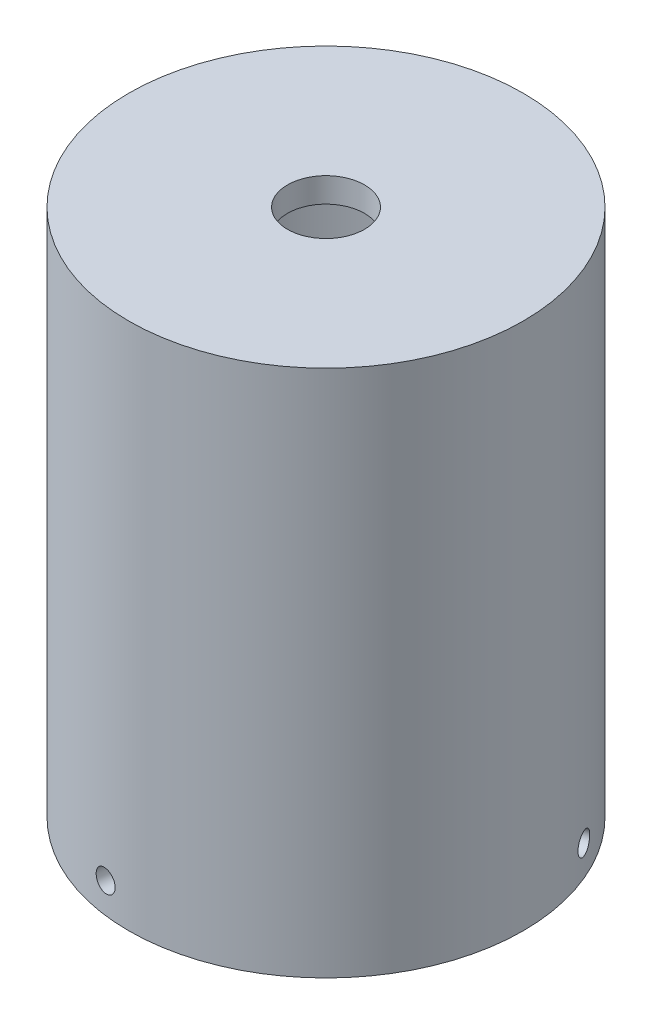
ISO-10303-21;
HEADER;
FILE_DESCRIPTION(('STEP AP214'),'2;1');
FILE_NAME('part.step','',(''),(''),'','','');
FILE_SCHEMA(('AUTOMOTIVE_DESIGN { 1 0 10303 214 1 1 1 1 }'));
ENDSEC;
DATA;
#1=APPLICATION_CONTEXT('core data for automotive mechanical design processes');
#2=APPLICATION_PROTOCOL_DEFINITION('international standard','automotive_design',2000,#1);
#3=PRODUCT_CONTEXT('',#1,'mechanical');
#4=PRODUCT('Part','Part','',(#3));
#5=PRODUCT_RELATED_PRODUCT_CATEGORY('part','',(#4));
#6=PRODUCT_DEFINITION_FORMATION('','',#4);
#7=PRODUCT_DEFINITION_CONTEXT('part definition',#1,'design');
#8=PRODUCT_DEFINITION('design','',#6,#7);
#9=PRODUCT_DEFINITION_SHAPE('','',#8);
#10=(LENGTH_UNIT() NAMED_UNIT(*) SI_UNIT(.MILLI.,.METRE.));
#11=(NAMED_UNIT(*) PLANE_ANGLE_UNIT() SI_UNIT($,.RADIAN.));
#12=(NAMED_UNIT(*) SI_UNIT($,.STERADIAN.) SOLID_ANGLE_UNIT());
#13=UNCERTAINTY_MEASURE_WITH_UNIT(LENGTH_MEASURE(1.E-05),#10,'distance_accuracy_value','');
#14=(GEOMETRIC_REPRESENTATION_CONTEXT(3) GLOBAL_UNCERTAINTY_ASSIGNED_CONTEXT((#13)) GLOBAL_UNIT_ASSIGNED_CONTEXT((#10,
#11,#12)) REPRESENTATION_CONTEXT('',''));
#15=CARTESIAN_POINT('',(0.,0.,0.));
#16=DIRECTION('',(0.,0.,1.));
#17=DIRECTION('',(1.,0.,0.));
#18=AXIS2_PLACEMENT_3D('',#15,#16,#17);
#19=CARTESIAN_POINT('',(0.,58.70448,0.));
#20=DIRECTION('',(0.,-1.,0.));
#21=DIRECTION('',(0.,0.,-1.));
#22=AXIS2_PLACEMENT_3D('',#19,#20,#21);
#23=CYLINDRICAL_SURFACE('',#22,20.32);
#24=CARTESIAN_POINT('',(0.,58.70448,0.));
#25=DIRECTION('',(0.,1.,0.));
#26=DIRECTION('',(0.,0.,1.));
#27=AXIS2_PLACEMENT_3D('',#24,#25,#26);
#28=CIRCLE('',#27,20.32);
#29=CARTESIAN_POINT('',(0.,58.70448,20.32));
#30=VERTEX_POINT('',#29);
#31=EDGE_CURVE('E135',#30,#30,#28,.T.);
#32=ORIENTED_EDGE('',*,*,#31,.F.);
#33=EDGE_LOOP('',(#32));
#34=FACE_BOUND('',#33,.T.);
#35=CARTESIAN_POINT('',(-1.44359005239669,7.42497444509593,20.268656782348));
#36=CARTESIAN_POINT('',(-1.44359287954379,7.36153771357379,20.268656847362));
#37=CARTESIAN_POINT('',(-1.44894348586358,7.29805623479731,20.2682776971704));
#38=CARTESIAN_POINT('',(-1.47020871378882,7.17284520761524,20.266746053452));
#39=CARTESIAN_POINT('',(-1.48613571866115,7.11111780139687,20.2655926533855));
#40=CARTESIAN_POINT('',(-1.52808637144115,6.99124680184932,20.2624725014437));
#41=CARTESIAN_POINT('',(-1.55410479522144,6.93310137222071,20.2605061703721));
#42=CARTESIAN_POINT('',(-1.61547725837342,6.82202542850606,20.2557047779409));
#43=CARTESIAN_POINT('',(-1.65082912199278,6.76909370297786,20.2528699190223));
#44=CARTESIAN_POINT('',(-1.72989494339083,6.66986762198261,20.2462696370903));
#45=CARTESIAN_POINT('',(-1.77361782159926,6.62358044007134,20.2425032201168));
#46=CARTESIAN_POINT('',(-1.86814720237509,6.53901864236272,20.2339979566597));
#47=CARTESIAN_POINT('',(-1.91895399659822,6.50074435663103,20.2292590701342));
#48=CARTESIAN_POINT('',(-2.02622937700267,6.43327401163424,20.2187956191118));
#49=CARTESIAN_POINT('',(-2.08270151656757,6.40408369763587,20.21307043436));
#50=CARTESIAN_POINT('',(-2.19966368768284,6.35564673260612,20.2006765864036));
#51=CARTESIAN_POINT('',(-2.26015368350121,6.33639999315687,20.194007931589));
#52=CARTESIAN_POINT('',(-2.38335648449181,6.30841590392441,20.1798377278012));
#53=CARTESIAN_POINT('',(-2.44606690059685,6.2996675920678,20.1723370565478));
#54=CARTESIAN_POINT('',(-2.57198133917894,6.29289485040135,20.1566697730695));
#55=CARTESIAN_POINT('',(-2.63518535705617,6.29487032077638,20.1485031670438));
#56=CARTESIAN_POINT('',(-2.76022047186734,6.30947999492297,20.1317549744249));
#57=CARTESIAN_POINT('',(-2.8220530104769,6.32210240306245,20.1231738569792));
#58=CARTESIAN_POINT('',(-2.94267201537549,6.35762935537082,20.1058895844784));
#59=CARTESIAN_POINT('',(-3.00145846666781,6.38053395015635,20.0971864288229));
#60=CARTESIAN_POINT('',(-3.11436685139023,6.4359885088971,20.079999643428));
#61=CARTESIAN_POINT('',(-3.16848616999787,6.4685438350595,20.0715161385895));
#62=CARTESIAN_POINT('',(-3.27051250942365,6.54237182140925,20.05514452497));
#63=CARTESIAN_POINT('',(-3.31841947535938,6.58364455860124,20.0472564214493));
#64=CARTESIAN_POINT('',(-3.4067479376852,6.67380244177053,20.0324357340963));
#65=CARTESIAN_POINT('',(-3.44715920684189,6.72269782330097,20.0255044590224));
#66=CARTESIAN_POINT('',(-3.51928947435293,6.82667711873191,20.0129544620733));
#67=CARTESIAN_POINT('',(-3.55100846995532,6.88176103459168,20.0073357406137));
#68=CARTESIAN_POINT('',(-3.60486968742671,6.99656013215168,19.9977015396717));
#69=CARTESIAN_POINT('',(-3.627011507189,7.056275508184,19.9936861275065));
#70=CARTESIAN_POINT('',(-3.66109562599073,7.17863953403089,19.9874731155825));
#71=CARTESIAN_POINT('',(-3.67303801999072,7.24128815653009,19.9852754988994));
#72=CARTESIAN_POINT('',(-3.68637886020456,7.36765044338576,19.9828190664023));
#73=CARTESIAN_POINT('',(-3.68779141156779,7.43136256836368,19.9825576569635));
#74=CARTESIAN_POINT('',(-3.6800701584885,7.55812230409682,19.9839810459443));
#75=CARTESIAN_POINT('',(-3.67093639736236,7.62116991758028,19.9856658363705));
#76=CARTESIAN_POINT('',(-3.64238798468351,7.74477060236504,19.9908883733897));
#77=CARTESIAN_POINT('',(-3.62297980911432,7.8053252191243,19.9944249527811));
#78=CARTESIAN_POINT('',(-3.57442881563469,7.92226863545931,20.003161338063));
#79=CARTESIAN_POINT('',(-3.54528592785232,7.9786574051307,20.0083611558915));
#80=CARTESIAN_POINT('',(-3.47804091056071,8.08573429461587,20.0201596775436));
#81=CARTESIAN_POINT('',(-3.43992928330127,8.13641628633745,20.0267598636004));
#82=CARTESIAN_POINT('',(-3.3558239875681,8.23057926371157,20.0410244210914));
#83=CARTESIAN_POINT('',(-3.30983025740412,8.27406019299887,20.0486888008546));
#84=CARTESIAN_POINT('',(-3.2111865131464,8.35263500806726,20.0647246698379));
#85=CARTESIAN_POINT('',(-3.15852924947262,8.38771963707267,20.0730969258481));
#86=CARTESIAN_POINT('',(-3.04807179835381,8.44844262109852,20.0901661815556));
#87=CARTESIAN_POINT('',(-2.99027163725712,8.47408102451086,20.0988631795891));
#88=CARTESIAN_POINT('',(-2.87118894999741,8.51516762603672,20.1162195604569));
#89=CARTESIAN_POINT('',(-2.80990846073175,8.53062171920799,20.1248789621645));
#90=CARTESIAN_POINT('',(-2.68556785406956,8.55092031488673,20.1418484945541));
#91=CARTESIAN_POINT('',(-2.62250774987123,8.55576489605688,20.1501586278254));
#92=CARTESIAN_POINT('',(-2.49648609130632,8.55470620160025,20.166159433982));
#93=CARTESIAN_POINT('',(-2.43352451885574,8.54881743142448,20.1738509282535));
#94=CARTESIAN_POINT('',(-2.30940573550969,8.52648921909342,20.1884360808148));
#95=CARTESIAN_POINT('',(-2.24824852792591,8.51004975757496,20.1953297376404));
#96=CARTESIAN_POINT('',(-2.12948137861428,8.46708993143515,20.2081983368409));
#97=CARTESIAN_POINT('',(-2.07187144379776,8.44056954717338,20.2141732774258));
#98=CARTESIAN_POINT('',(-1.96184305937155,8.37820294763725,20.2251485184302));
#99=CARTESIAN_POINT('',(-1.90942446092262,8.34235699984022,20.2301488467964));
#100=CARTESIAN_POINT('',(-1.81121165494345,8.26230398349598,20.2391786359853));
#101=CARTESIAN_POINT('',(-1.76542573837346,8.21808660703176,20.243206885809));
#102=CARTESIAN_POINT('',(-1.68185892945029,8.12255641047416,20.2503213430568));
#103=CARTESIAN_POINT('',(-1.64408000491755,8.0712418512664,20.2534073189869));
#104=CARTESIAN_POINT('',(-1.57759580572137,7.96292586948607,20.2586946380887));
#105=CARTESIAN_POINT('',(-1.54890035479226,7.90591837705834,20.2608950241922));
#106=CARTESIAN_POINT('',(-1.50149842297478,7.7879207329299,20.2644633001595));
#107=CARTESIAN_POINT('',(-1.48278018527451,7.72693536420417,20.2658321701208));
#108=CARTESIAN_POINT('',(-1.46076605617782,7.62547366911425,20.2674278262941));
#109=CARTESIAN_POINT('',(-1.45433346488306,7.58565398005583,20.2678892094909));
#110=CARTESIAN_POINT('',(-1.44574456731452,7.50555369464658,20.2685036667013));
#111=CARTESIAN_POINT('',(-1.44358825643055,7.4652730987927,20.2686567410474));
#112=CARTESIAN_POINT('',(-1.44359005239669,7.42497444509593,20.268656782348));
#113=B_SPLINE_CURVE_WITH_KNOTS('',3,(#35,#36,#37,#38,#39,#40,#41,#42,#43,#44,#45,#46,#47,#48,
#49,#50,#51,#52,#53,#54,#55,#56,#57,#58,#59,#60,#61,#62,#63,#64,#65,#66,#67,#68,#69,#70,#71,#72,
#73,#74,#75,#76,#77,#78,#79,#80,#81,#82,#83,#84,#85,#86,#87,#88,#89,#90,#91,#92,#93,#94,#95,#96,
#97,#98,#99,#100,#101,#102,#103,#104,#105,#106,#107,#108,#109,#110,#111,#112),.UNSPECIFIED.,.T.,
.F.,(4,2,2,2,2,2,2,2,2,2,2,2,2,2,2,2,2,2,2,2,2,2,2,2,2,2,2,2,2,2,2,2,2,2,2,2,2,2,4),(0.,
0.190163084943531,0.380549213866286,0.570836914933274,0.761080296444164,0.951527547471873,
1.1419826418229,1.33255794811556,1.52313155979104,1.71350600785987,1.90387868395929,
2.09404072474507,2.28420370166144,2.47447253694292,2.66474305302133,2.85527129729503,
3.04579960188972,3.23633590521789,3.42687043456114,3.61714968926747,3.8074281624513,
3.99758684528703,4.18774689303622,4.37810923067155,4.5684730582691,4.75904580169289,
4.94961756882145,5.14007892880164,5.33053887662909,5.5207416206067,5.71094471365482,
5.90114817727284,6.09134618604551,6.28177993099796,6.47226042334224,6.66294622114769,
6.85340682168653,6.97420946053435,7.09501196914681),.UNSPECIFIED.);
#114=CARTESIAN_POINT('',(-1.44359005239669,7.42497444509593,20.268656782348));
#115=VERTEX_POINT('',#114);
#116=EDGE_CURVE('E66',#115,#115,#113,.T.);
#117=ORIENTED_EDGE('',*,*,#116,.T.);
#118=EDGE_LOOP('',(#117));
#119=FACE_BOUND('',#118,.T.);
#120=CARTESIAN_POINT('',(-16.8313766479027,7.42497444509593,-11.3845140492001));
#121=CARTESIAN_POINT('',(-16.831375290633,7.36153771357379,-11.3845165300883));
#122=CARTESIAN_POINT('',(-16.8283716337753,7.29805623479731,-11.3889607159911));
#123=CARTESIAN_POINT('',(-16.816412577443,7.17284520761524,-11.4066111217324));
#124=CARTESIAN_POINT('',(-16.8074502012485,7.11111780139687,-11.4198276125248));
#125=CARTESIAN_POINT('',(-16.7837727440132,6.99124680184932,-11.4545978675668));
#126=CARTESIAN_POINT('',(-16.7690606394628,6.93310137222071,-11.4761473179911));
#127=CARTESIAN_POINT('',(-16.7342162800679,6.82202542850606,-11.5268967339579));
#128=CARTESIAN_POINT('',(-16.7140852884186,6.76909370297786,-11.5560949164642));
#129=CARTESIAN_POINT('',(-16.6688363658943,6.66986762198261,-11.6212677853999));
#130=CARTESIAN_POINT('',(-16.6437131140098,6.62358044007134,-11.6572497001683));
#131=CARTESIAN_POINT('',(-16.5890826494021,6.53901864236272,-11.7348619135956));
#132=CARTESIAN_POINT('',(-16.5595752561738,6.50074435663103,-11.7764924448149));
#133=CARTESIAN_POINT('',(-16.4968759515749,6.43327401163424,-11.8641639239346));
#134=CARTESIAN_POINT('',(-16.4636817263561,6.40408369763587,-11.910207639028));
#135=CARTESIAN_POINT('',(-16.3944672536176,6.35564673260612,-12.0053029265174));
#136=CARTESIAN_POINT('',(-16.3584470312299,6.33639999315687,-12.0543544721636));
#137=CARTESIAN_POINT('',(-16.2845738742775,6.30841590392441,-12.1539661257449));
#138=CARTESIAN_POINT('',(-16.2467228943741,6.2996675920678,-12.2045246035471));
#139=CARTESIAN_POINT('',(-16.1701974095826,6.29289485040135,-12.3057360643233));
#140=CARTESIAN_POINT('',(-16.131522912363,6.29487032077638,-12.3563890464134));
#141=CARTESIAN_POINT('',(-16.054500994682,6.30947999492297,-12.4562985358955));
#142=CARTESIAN_POINT('',(-16.0161532596763,6.32210240306245,-12.505556526389));
#143=CARTESIAN_POINT('',(-15.9408751381554,6.35762935537082,-12.60137351256));
#144=CARTESIAN_POINT('',(-15.9039447586185,6.38053395015635,-12.6479324949497));
#145=CARTESIAN_POINT('',(-15.8326063734959,6.43598850889709,-12.7371206317222));
#146=CARTESIAN_POINT('',(-15.7981997834889,6.4685438350595,-12.7797475840526));
#147=CARTESIAN_POINT('',(-15.7330083804805,6.54237182140925,-12.8599191790408));
#148=CARTESIAN_POINT('',(-15.702223599476,6.58364455860124,-12.897463776799));
#149=CARTESIAN_POINT('',(-15.6452242765639,6.67380244177053,-12.9665481253739));
#150=CARTESIAN_POINT('',(-15.619015981691,6.72269782330097,-12.9980796735258));
#151=CARTESIAN_POINT('',(-15.5720822317601,6.82667711873191,-13.0542713190976));
#152=CARTESIAN_POINT('',(-15.5513567784381,6.88176103459168,-13.0789314143419));
#153=CARTESIAN_POINT('',(-15.5160827069415,6.99656013215168,-13.1207594964799));
#154=CARTESIAN_POINT('',(-15.5015343481186,7.056275508184,-13.1379271687975));
#155=CARTESIAN_POINT('',(-15.4791116625575,7.17863953403089,-13.1643383755834));
#156=CARTESIAN_POINT('',(-15.4712372736822,7.24128815653009,-13.1735819838278));
#157=CARTESIAN_POINT('',(-15.4624395206301,7.36765044338576,-13.1839072741123));
#158=CARTESIAN_POINT('',(-15.4615068577336,7.43136256836368,-13.1849998747576));
#159=CARTESIAN_POINT('',(-15.4666001752902,7.55812230409682,-13.1790247679323));
#160=CARTESIAN_POINT('',(-15.4726261271624,7.62116991758028,-13.1719570939781));
#161=CARTESIAN_POINT('',(-15.4914231832326,7.74477060236504,-13.14984471187));
#162=CARTESIAN_POINT('',(-15.5041900386127,7.8053252191243,-13.1348050284817));
#163=CARTESIAN_POINT('',(-15.5360314669439,7.92226863545931,-13.0971268273903));
#164=CARTESIAN_POINT('',(-15.5551060851696,7.9786574051307,-13.0744882551454));
#165=CARTESIAN_POINT('',(-15.5989464132932,8.08573429461587,-13.022151622719));
#166=CARTESIAN_POINT('',(-15.6237181557178,8.13641628633745,-12.9924460783611));
#167=CARTESIAN_POINT('',(-15.6781242727453,8.23057926371157,-12.9267410344089));
#168=CARTESIAN_POINT('',(-15.7077586854065,8.27406019299888,-12.8907414855537));
#169=CARTESIAN_POINT('',(-15.7709680274467,8.35263500806727,-12.8133314315938));
#170=CARTESIAN_POINT('',(-15.8045472456754,8.38771963707267,-12.7719150315636));
#171=CARTESIAN_POINT('',(-15.8745583803012,8.44844262109852,-12.6847907007112));
#172=CARTESIAN_POINT('',(-15.9109902820832,8.47408102451086,-12.6390827918754));
#173=CARTESIAN_POINT('',(-15.9855626924624,8.51516762603672,-12.5446323499915));
#174=CARTESIAN_POINT('',(-16.0237021989555,8.530621719208,-12.4958915903848));
#175=CARTESIAN_POINT('',(-16.1005685484264,8.55092031488674,-12.3966942324882));
#176=CARTESIAN_POINT('',(-16.1392953870473,8.55576489605688,-12.3462376469228));
#177=CARTESIAN_POINT('',(-16.2161633209424,8.55470620160025,-12.2451000922568));
#178=CARTESIAN_POINT('',(-16.2543051365999,8.54881743142448,-12.1944195181882));
#179=CARTESIAN_POINT('',(-16.3289956409091,8.52648921909342,-12.0942220750044));
#180=CARTESIAN_POINT('',(-16.3655443266369,8.51004975757496,-12.0447052080251));
#181=CARTESIAN_POINT('',(-16.4360724351114,8.46708993143515,-11.9482841391864));
#182=CARTESIAN_POINT('',(-16.4700518528523,8.44056954717338,-11.9013799424174));
#183=CARTESIAN_POINT('',(-16.5345708825879,8.37820294763725,-11.8115801868691));
#184=CARTESIAN_POINT('',(-16.5651105932048,8.34235699984022,-11.7686845131647));
#185=CARTESIAN_POINT('',(-16.6220370230228,8.26230398349598,-11.6881446228042));
#186=CARTESIAN_POINT('',(-16.6484185479879,8.21808660703176,-11.6505069808309));
#187=CARTESIAN_POINT('',(-16.6963632531602,8.12255641047416,-11.5816932300141));
#188=CARTESIAN_POINT('',(-16.7179252489775,8.07124185126639,-11.5505187096062));
#189=CARTESIAN_POINT('',(-16.7557463012357,7.96292586948607,-11.4955853637029));
#190=CARTESIAN_POINT('',(-16.771999616964,7.90591837705833,-11.471834567277));
#191=CARTESIAN_POINT('',(-16.7987908005081,7.78792073292989,-11.4325674281182));
#192=CARTESIAN_POINT('',(-16.8093353955193,7.72693536420417,-11.4170413937364));
#193=CARTESIAN_POINT('',(-16.8217243388494,7.62547366911425,-11.3987744267831));
#194=CARTESIAN_POINT('',(-16.825340204066,7.58565398005583,-11.3934343309081));
#195=CARTESIAN_POINT('',(-16.8301667884041,7.50555369464658,-11.3863033560284));
#196=CARTESIAN_POINT('',(-16.8313775101184,7.4652730987927,-11.3845124731975));
#197=CARTESIAN_POINT('',(-16.8313766479027,7.42497444509593,-11.3845140492001));
#198=B_SPLINE_CURVE_WITH_KNOTS('',3,(#120,#121,#122,#123,#124,#125,#126,#127,#128,#129,#130,
#131,#132,#133,#134,#135,#136,#137,#138,#139,#140,#141,#142,#143,#144,#145,#146,#147,#148,#149,
#150,#151,#152,#153,#154,#155,#156,#157,#158,#159,#160,#161,#162,#163,#164,#165,#166,#167,#168,
#169,#170,#171,#172,#173,#174,#175,#176,#177,#178,#179,#180,#181,#182,#183,#184,#185,#186,#187,
#188,#189,#190,#191,#192,#193,#194,#195,#196,#197),.UNSPECIFIED.,.T.,.F.,(4,2,2,2,2,2,2,2,2,2,2,
2,2,2,2,2,2,2,2,2,2,2,2,2,2,2,2,2,2,2,2,2,2,2,2,2,2,2,4),(0.,0.19016308494353,0.380549213866286,
0.570836914933275,0.761080296444163,0.951527547471873,1.1419826418229,1.33255794811556,
1.52313155979104,1.71350600785988,1.90387868395929,2.09404072474506,2.28420370166144,
2.47447253694292,2.66474305302133,2.85527129729503,3.04579960188972,3.23633590521789,
3.42687043456114,3.61714968926746,3.8074281624513,3.99758684528703,4.18774689303622,
4.37810923067155,4.5684730582691,4.75904580169289,4.94961756882145,5.14007892880164,
5.33053887662909,5.5207416206067,5.71094471365482,5.90114817727285,6.09134618604551,
6.28177993099795,6.47226042334224,6.66294622114769,6.85340682168653,6.97420946053435,
7.0950119691468),.UNSPECIFIED.);
#199=CARTESIAN_POINT('',(-16.8313766479027,7.42497444509593,-11.3845140492001));
#200=VERTEX_POINT('',#199);
#201=EDGE_CURVE('E60',#200,#200,#198,.T.);
#202=ORIENTED_EDGE('',*,*,#201,.T.);
#203=EDGE_LOOP('',(#202));
#204=FACE_BOUND('',#203,.T.);
#205=CARTESIAN_POINT('',(18.2749667002996,7.42497444509593,-8.88414273314778));
#206=CARTESIAN_POINT('',(18.2749681701769,7.36153771357379,-8.88414031727359));
#207=CARTESIAN_POINT('',(18.277315119639,7.29805623479731,-8.8793169811792));
#208=CARTESIAN_POINT('',(18.2866212912319,7.17284520761524,-8.86013493171946));
#209=CARTESIAN_POINT('',(18.2935859199098,7.11111780139687,-8.84576504086056));
#210=CARTESIAN_POINT('',(18.3118591154545,6.99124680184932,-8.80787463387686));
#211=CARTESIAN_POINT('',(18.3231654346844,6.93310137222071,-8.78435885238088));
#212=CARTESIAN_POINT('',(18.3496935384414,6.82202542850606,-8.72880804398284));
#213=CARTESIAN_POINT('',(18.3649144104115,6.76909370297786,-8.69677500255809));
#214=CARTESIAN_POINT('',(18.3987313092853,6.66986762198261,-8.62500185169029));
#215=CARTESIAN_POINT('',(18.4173309356092,6.62358044007134,-8.58525351994847));
#216=CARTESIAN_POINT('',(18.4572298517773,6.53901864236272,-8.49913604306401));
#217=CARTESIAN_POINT('',(18.4785292527722,6.50074435663103,-8.45276662531918));
#218=CARTESIAN_POINT('',(18.5231053285777,6.43327401163424,-8.35463169517708));
#219=CARTESIAN_POINT('',(18.5463832429238,6.40408369763587,-8.30286279533194));
#220=CARTESIAN_POINT('',(18.5941309413006,6.35564673260612,-8.19537365988614));
#221=CARTESIAN_POINT('',(18.6186007147312,6.33639999315687,-8.1396534594253));
#222=CARTESIAN_POINT('',(18.6679303587694,6.30841590392441,-8.02587160205614));
#223=CARTESIAN_POINT('',(18.6927897949711,6.2996675920678,-7.96781245300057));
#224=CARTESIAN_POINT('',(18.7421787487616,6.29289485040135,-7.85093370874609));
#225=CARTESIAN_POINT('',(18.7667082694193,6.29487032077638,-7.7921141206303));
#226=CARTESIAN_POINT('',(18.8147214665495,6.30947999492297,-7.6754564385293));
#227=CARTESIAN_POINT('',(18.8382062701534,6.32210240306245,-7.61761733059005));
#228=CARTESIAN_POINT('',(18.8835471535311,6.35762935537082,-7.50451607191829));
#229=CARTESIAN_POINT('',(18.9054032252864,6.38053395015635,-7.44925393387305));
#230=CARTESIAN_POINT('',(18.9469732248863,6.43598850889709,-7.34287901170573));
#231=CARTESIAN_POINT('',(18.9666859534869,6.4685438350595,-7.29176855453677));
#232=CARTESIAN_POINT('',(19.0035208899043,6.54237182140925,-7.19522534592915));
#233=CARTESIAN_POINT('',(19.0206430748355,6.58364455860124,-7.1497926446502));
#234=CARTESIAN_POINT('',(19.0519722142492,6.67380244177053,-7.06588760872235));
#235=CARTESIAN_POINT('',(19.066175188533,6.72269782330097,-7.02742478549655));
#236=CARTESIAN_POINT('',(19.0913717061132,6.82667711873191,-6.95868314297567));
#237=CARTESIAN_POINT('',(19.1023652483935,6.88176103459168,-6.92840432627164));
#238=CARTESIAN_POINT('',(19.1209523943683,6.99656013215168,-6.87694204319169));
#239=CARTESIAN_POINT('',(19.1285458553077,7.056275508184,-6.85575895870889));
#240=CARTESIAN_POINT('',(19.1402072885483,7.17863953403089,-6.82313473999899));
#241=CARTESIAN_POINT('',(19.144275293673,7.24128815653009,-6.81169351507146));
#242=CARTESIAN_POINT('',(19.1488183808347,7.36765044338576,-6.79891179228989));
#243=CARTESIAN_POINT('',(19.1492982693016,7.43136256836368,-6.79755778220577));
#244=CARTESIAN_POINT('',(19.1466703337788,7.55812230409682,-6.80495627801193));
#245=CARTESIAN_POINT('',(19.1435625245249,7.62116991758028,-6.81370874239234));
#246=CARTESIAN_POINT('',(19.1338111679162,7.74477060236504,-6.84104366151953));
#247=CARTESIAN_POINT('',(19.1271698477272,7.8053252191243,-6.8596199242993));
#248=CARTESIAN_POINT('',(19.1104602825787,7.92226863545931,-6.90603451067257));
#249=CARTESIAN_POINT('',(19.100392013022,7.9786574051307,-6.93387290074597));
#250=CARTESIAN_POINT('',(19.076987323854,8.08573429461587,-6.99800805482448));
#251=CARTESIAN_POINT('',(19.0636474390192,8.13641628633745,-7.0343137852391));
#252=CARTESIAN_POINT('',(19.0339482603136,8.23057926371157,-7.11428338668234));
#253=CARTESIAN_POINT('',(19.0175889428108,8.27406019299888,-7.15794731530077));
#254=CARTESIAN_POINT('',(18.9821545405932,8.35263500806727,-7.25139323824401));
#255=CARTESIAN_POINT('',(18.9630764951481,8.38771963707267,-7.30118189428437));
#256=CARTESIAN_POINT('',(18.9226301786551,8.44844262109852,-7.40537548084431));
#257=CARTESIAN_POINT('',(18.9012619193405,8.47408102451086,-7.45978038771362));
#258=CARTESIAN_POINT('',(18.8567516424599,8.51516762603672,-7.57158721046537));
#259=CARTESIAN_POINT('',(18.8336106596874,8.53062171920799,-7.62898737177953));
#260=CARTESIAN_POINT('',(18.7861364024961,8.55092031488673,-7.74515426206578));
#261=CARTESIAN_POINT('',(18.7618031369187,8.55576489605688,-7.80392098090247));
#262=CARTESIAN_POINT('',(18.7126494122488,8.55470620160025,-7.92105934172502));
#263=CARTESIAN_POINT('',(18.6878296554557,8.54881743142448,-7.97943141006519));
#264=CARTESIAN_POINT('',(18.6384013764189,8.52648921909342,-8.09421400581036));
#265=CARTESIAN_POINT('',(18.6137928545629,8.51004975757496,-8.15062452961523));
#266=CARTESIAN_POINT('',(18.5655538137258,8.46708993143515,-8.25991419765438));
#267=CARTESIAN_POINT('',(18.5419232966502,8.44056954717338,-8.31279333500832));
#268=CARTESIAN_POINT('',(18.4964139419596,8.37820294763725,-8.41356833156097));
#269=CARTESIAN_POINT('',(18.4745350541276,8.34235699984022,-8.46146433363165));
#270=CARTESIAN_POINT('',(18.4332486779664,8.26230398349598,-8.55103401318102));
#271=CARTESIAN_POINT('',(18.4138442863615,8.21808660703175,-8.59269990497802));
#272=CARTESIAN_POINT('',(18.3782221826106,8.12255641047416,-8.66862811304257));
#273=CARTESIAN_POINT('',(18.3620052538952,8.07124185126639,-8.70288860938065));
#274=CARTESIAN_POINT('',(18.3333421069572,7.96292586948607,-8.76310927438569));
#275=CARTESIAN_POINT('',(18.3208999717564,7.90591837705833,-8.78906045691508));
#276=CARTESIAN_POINT('',(18.300289223483,7.78792073292989,-8.83189587204114));
#277=CARTESIAN_POINT('',(18.2921155807939,7.72693536420417,-8.84879077638432));
#278=CARTESIAN_POINT('',(18.2824903950273,7.62547366911425,-8.86865339951088));
#279=CARTESIAN_POINT('',(18.2796736689492,7.58565398005583,-8.87445487858269));
#280=CARTESIAN_POINT('',(18.2759113557187,7.50555369464658,-8.88220031067276));
#281=CARTESIAN_POINT('',(18.2749657665491,7.4652730987927,-8.88414426784976));
#282=CARTESIAN_POINT('',(18.2749667002996,7.42497444509593,-8.88414273314778));
#283=B_SPLINE_CURVE_WITH_KNOTS('',3,(#205,#206,#207,#208,#209,#210,#211,#212,#213,#214,#215,
#216,#217,#218,#219,#220,#221,#222,#223,#224,#225,#226,#227,#228,#229,#230,#231,#232,#233,#234,
#235,#236,#237,#238,#239,#240,#241,#242,#243,#244,#245,#246,#247,#248,#249,#250,#251,#252,#253,
#254,#255,#256,#257,#258,#259,#260,#261,#262,#263,#264,#265,#266,#267,#268,#269,#270,#271,#272,
#273,#274,#275,#276,#277,#278,#279,#280,#281,#282),.UNSPECIFIED.,.T.,.F.,(4,2,2,2,2,2,2,2,2,2,2,
2,2,2,2,2,2,2,2,2,2,2,2,2,2,2,2,2,2,2,2,2,2,2,2,2,2,2,4),(0.,0.19016308494353,0.380549213866286,
0.570836914933273,0.761080296444164,0.95152754747187,1.1419826418229,1.33255794811556,
1.52313155979104,1.71350600785987,1.90387868395929,2.09404072474506,2.28420370166144,
2.47447253694292,2.66474305302133,2.85527129729503,3.04579960188972,3.23633590521789,
3.42687043456114,3.61714968926747,3.8074281624513,3.99758684528702,4.18774689303622,
4.37810923067155,4.5684730582691,4.75904580169289,4.94961756882145,5.14007892880164,
5.33053887662909,5.5207416206067,5.71094471365482,5.90114817727285,6.09134618604551,
6.28177993099796,6.47226042334224,6.66294622114769,6.85340682168653,6.97420946053435,
7.0950119691468),.UNSPECIFIED.);
#284=CARTESIAN_POINT('',(18.2749667002996,7.42497444509593,-8.88414273314778));
#285=VERTEX_POINT('',#284);
#286=EDGE_CURVE('E12',#285,#285,#283,.T.);
#287=ORIENTED_EDGE('',*,*,#286,.T.);
#288=EDGE_LOOP('',(#287));
#289=FACE_BOUND('',#288,.T.);
#290=CARTESIAN_POINT('',(0.,4.318,0.));
#291=DIRECTION('',(0.,-1.,0.));
#292=DIRECTION('',(0.,0.,-1.));
#293=AXIS2_PLACEMENT_3D('',#290,#291,#292);
#294=CIRCLE('',#293,20.32);
#295=CARTESIAN_POINT('',(0.,4.318,-20.32));
#296=VERTEX_POINT('',#295);
#297=EDGE_CURVE('E98',#296,#296,#294,.T.);
#298=ORIENTED_EDGE('',*,*,#297,.F.);
#299=EDGE_LOOP('',(#298));
#300=FACE_BOUND('',#299,.T.);
#301=ADVANCED_FACE('F51',(#34,#119,#204,#289,#300),#23,.T.);
#302=CARTESIAN_POINT('',(0.,58.70448,0.));
#303=DIRECTION('',(0.,-1.,0.));
#304=DIRECTION('',(0.,0.,-1.));
#305=AXIS2_PLACEMENT_3D('',#302,#303,#304);
#306=CYLINDRICAL_SURFACE('',#305,17.78);
#307=CARTESIAN_POINT('',(0.,56.16448,0.));
#308=DIRECTION('',(0.,1.,0.));
#309=DIRECTION('',(0.,0.,1.));
#310=AXIS2_PLACEMENT_3D('',#307,#308,#309);
#311=CIRCLE('',#310,17.78);
#312=CARTESIAN_POINT('',(0.,56.16448,17.78));
#313=VERTEX_POINT('',#312);
#314=EDGE_CURVE('E139',#313,#313,#311,.T.);
#315=ORIENTED_EDGE('',*,*,#314,.T.);
#316=EDGE_LOOP('',(#315));
#317=FACE_BOUND('',#316,.T.);
#318=CARTESIAN_POINT('',(-1.12192092528291,7.42497444509593,17.7445679980498));
#319=CARTESIAN_POINT('',(-1.12192375349478,7.36155385991432,17.7445681224307));
#320=CARTESIAN_POINT('',(-1.12727708922739,7.29808892219255,17.7442318622863));
#321=CARTESIAN_POINT('',(-1.14855209524364,7.17291163020552,17.7428672238823));
#322=CARTESIAN_POINT('',(-1.16448605212705,7.1112014005517,17.7418380409565));
#323=CARTESIAN_POINT('',(-1.20645197302339,6.99136484348823,17.739033606785));
#324=CARTESIAN_POINT('',(-1.23247858923199,6.9332366369417,17.7372587506083));
#325=CARTESIAN_POINT('',(-1.29386605138906,6.82219173500704,17.732886199186));
#326=CARTESIAN_POINT('',(-1.32922476629674,6.76927385359314,17.7302886917707));
#327=CARTESIAN_POINT('',(-1.40831261186244,6.67005456455936,17.7241819585341));
#328=CARTESIAN_POINT('',(-1.45205312577119,6.62376230623945,17.720671490486));
#329=CARTESIAN_POINT('',(-1.5466174141282,6.53918664460727,17.7126683887366));
#330=CARTESIAN_POINT('',(-1.59744148448639,6.50090357603971,17.708175714));
#331=CARTESIAN_POINT('',(-1.70476060384354,6.43340492470139,17.6981663924993));
#332=CARTESIAN_POINT('',(-1.76126033011421,6.40419690309766,17.6926488979559));
#333=CARTESIAN_POINT('',(-1.87827585895629,6.35572586993187,17.6806090284681));
#334=CARTESIAN_POINT('',(-1.93879161732126,6.33646274892185,17.6740866645837));
#335=CARTESIAN_POINT('',(-2.06202128099163,6.30845368809972,17.6601332385846));
#336=CARTESIAN_POINT('',(-2.12473207393512,6.29969343204862,17.6527034286572));
#337=CARTESIAN_POINT('',(-2.25063909785385,6.29289456037897,17.6370929310431));
#338=CARTESIAN_POINT('',(-2.31383532319053,6.29485582041166,17.6289122520661));
#339=CARTESIAN_POINT('',(-2.43882453735149,6.30943250184821,17.6120557291719));
#340=CARTESIAN_POINT('',(-2.50061942199265,6.32203252306039,17.60338061789));
#341=CARTESIAN_POINT('',(-2.62115774189674,6.35750515827828,17.5858364618344));
#342=CARTESIAN_POINT('',(-2.67990115862039,6.3803778346877,17.5769674158828));
#343=CARTESIAN_POINT('',(-2.79273244080218,6.43576393475215,17.5593938284707));
#344=CARTESIAN_POINT('',(-2.84681690116242,6.46828433379092,17.5506894108983));
#345=CARTESIAN_POINT('',(-2.94877736939161,6.54203766930781,17.533846884358));
#346=CARTESIAN_POINT('',(-2.99665330488807,6.58327070733403,17.525708781992));
#347=CARTESIAN_POINT('',(-3.08494783270255,6.67336583529285,17.5103830038587));
#348=CARTESIAN_POINT('',(-3.12535308236891,6.72224129276084,17.5031970349646));
#349=CARTESIAN_POINT('',(-3.19747838861756,6.82618704172531,17.4901652240904));
#350=CARTESIAN_POINT('',(-3.22919844161457,6.88125733577903,17.4843193826635));
#351=CARTESIAN_POINT('',(-3.28307112763267,6.99603810297975,17.4742839226448));
#352=CARTESIAN_POINT('',(-3.30522319605776,7.05574884970939,17.4700944017919));
#353=CARTESIAN_POINT('',(-3.33933642904058,7.17811160602603,17.4636060519895));
#354=CARTESIAN_POINT('',(-3.35129771764993,7.24076357979991,17.461307200025));
#355=CARTESIAN_POINT('',(-3.36468158306898,7.36711297870149,17.4587332070104));
#356=CARTESIAN_POINT('',(-3.36612256156826,7.43080838295077,17.458454532356));
#357=CARTESIAN_POINT('',(-3.35847399320026,7.55753971642293,17.459927463124));
#358=CARTESIAN_POINT('',(-3.34938450304961,7.62057564919586,17.4616790576115));
#359=CARTESIAN_POINT('',(-3.32094201910825,7.74414576080705,17.4671105591458));
#360=CARTESIAN_POINT('',(-3.30159750964144,7.80468196319541,17.4707888721234));
#361=CARTESIAN_POINT('',(-3.25318988841753,7.92159668016794,17.4798672328965));
#362=CARTESIAN_POINT('',(-3.22412668547676,7.97797515573702,17.4852672968459));
#363=CARTESIAN_POINT('',(-3.15704172014647,8.08505992626636,17.497504030896));
#364=CARTESIAN_POINT('',(-3.11900758175225,8.13575824125536,17.5043426842048));
#365=CARTESIAN_POINT('',(-3.03505724276438,8.22996315177371,17.5190935569566));
#366=CARTESIAN_POINT('',(-2.9891409624059,8.27346967451562,17.5270057872637));
#367=CARTESIAN_POINT('',(-2.89062853288634,8.35211920562258,17.543521877339));
#368=CARTESIAN_POINT('',(-2.8380228830701,8.38725011031592,17.5521267142826));
#369=CARTESIAN_POINT('',(-2.72765209491177,8.4480683323272,17.5696167225243));
#370=CARTESIAN_POINT('',(-2.66988698928787,8.47375570952509,17.5785018920444));
#371=CARTESIAN_POINT('',(-2.55086487529489,8.51493666530467,17.5961672602734));
#372=CARTESIAN_POINT('',(-2.48961052598464,8.53043789646313,17.604947532908));
#373=CARTESIAN_POINT('',(-2.365302392203,8.55083157975219,17.6220793151957));
#374=CARTESIAN_POINT('',(-2.30224862616809,8.55572414053763,17.6304308292394));
#375=CARTESIAN_POINT('',(-2.17624700881646,8.55476053801279,17.6464266960445));
#376=CARTESIAN_POINT('',(-2.11329916679649,8.54892331342617,17.6540722698217));
#377=CARTESIAN_POINT('',(-1.98918941886186,8.52670511419526,17.6684869155589));
#378=CARTESIAN_POINT('',(-1.92802751606204,8.51032412116277,17.6752559859903));
#379=CARTESIAN_POINT('',(-1.80923385420834,8.46748767930936,17.6878105870634));
#380=CARTESIAN_POINT('',(-1.75160206407986,8.44103231918508,17.6935961263636));
#381=CARTESIAN_POINT('',(-1.64151236905794,8.37880072174474,17.7041492036075));
#382=CARTESIAN_POINT('',(-1.5890543323591,8.34302472196385,17.7089167674886));
#383=CARTESIAN_POINT('',(-1.49072562319612,8.26309734362917,17.7174654278088));
#384=CARTESIAN_POINT('',(-1.44486595158998,8.21893225667073,17.721244885244));
#385=CARTESIAN_POINT('',(-1.36114351692207,8.12349912195369,17.7278723233067));
#386=CARTESIAN_POINT('',(-1.32328271275956,8.07222933935462,17.7307200758558));
#387=CARTESIAN_POINT('',(-1.25662456557875,7.96398178317148,17.7355692486065));
#388=CARTESIAN_POINT('',(-1.2278387817273,7.90699685074057,17.7375695905372));
#389=CARTESIAN_POINT('',(-1.18026186543953,7.7890298368992,17.7407991895189));
#390=CARTESIAN_POINT('',(-1.16145903647722,7.72805252771462,17.742029349258));
#391=CARTESIAN_POINT('',(-1.13927718630227,7.62641468597365,17.7434640676212));
#392=CARTESIAN_POINT('',(-1.13277718095254,7.58641100601804,17.7438788054863));
#393=CARTESIAN_POINT('',(-1.12409815075606,7.50593572457116,17.7444307307957));
#394=CARTESIAN_POINT('',(-1.12191911966428,7.46546412375624,17.7445679186411));
#395=CARTESIAN_POINT('',(-1.12192092528291,7.42497444509593,17.7445679980498));
#396=B_SPLINE_CURVE_WITH_KNOTS('',3,(#318,#319,#320,#321,#322,#323,#324,#325,#326,#327,#328,
#329,#330,#331,#332,#333,#334,#335,#336,#337,#338,#339,#340,#341,#342,#343,#344,#345,#346,#347,
#348,#349,#350,#351,#352,#353,#354,#355,#356,#357,#358,#359,#360,#361,#362,#363,#364,#365,#366,
#367,#368,#369,#370,#371,#372,#373,#374,#375,#376,#377,#378,#379,#380,#381,#382,#383,#384,#385,
#386,#387,#388,#389,#390,#391,#392,#393,#394,#395),.UNSPECIFIED.,.T.,.F.,(4,2,2,2,2,2,2,2,2,2,2,
2,2,2,2,2,2,2,2,2,2,2,2,2,2,2,2,2,2,2,2,2,2,2,2,2,2,2,4),(0.,0.190113941969362,
0.380449038096521,0.57068341873966,0.760874395749524,0.95132552397421,1.14178461052928,
1.33240196127523,1.5230172141495,1.71337234681914,1.90372527174385,2.09380312181098,
2.28388212656737,2.47409889635179,2.66431788328493,2.85487338732205,3.04542897002125,
3.23599579565522,3.42656030150005,3.61679139978647,3.80702147350174,3.99709440850811,
4.18716912688519,4.3775076157828,4.56784803096018,4.75846186355588,4.9490744874779,
5.13954374505705,5.33001105182592,5.52014249498166,5.71027426972531,5.90040437055159,
6.09052962641333,6.28096827649581,6.47145351052413,6.66218040096031,6.85268333037952,
6.97405817298713,7.09543284017354),.UNSPECIFIED.);
#397=CARTESIAN_POINT('',(-1.12192092528291,7.42497444509593,17.7445679980498));
#398=VERTEX_POINT('',#397);
#399=EDGE_CURVE('E114',#398,#398,#396,.T.);
#400=ORIENTED_EDGE('',*,*,#399,.F.);
#401=EDGE_LOOP('',(#400));
#402=FACE_BOUND('',#401,.T.);
#403=CARTESIAN_POINT('',(-14.80628620285,7.42497444509593,-9.8438960213573));
#404=CARTESIAN_POINT('',(-14.8062848964611,7.36155385991432,-9.84389853285111));
#405=CARTESIAN_POINT('',(-14.8033170187674,7.29808892219255,-9.84836652751831));
#406=CARTESIAN_POINT('',(-14.7914977042345,7.17291163020552,-9.86610890399208));
#407=CARTESIAN_POINT('',(-14.7826394272339,7.11120140055169,-9.879393523973));
#408=CARTESIAN_POINT('',(-14.75922775555,6.99136484348823,-9.9143348604767));
#409=CARTESIAN_POINT('',(-14.7446773769086,6.9332366369417,-9.93598714319954));
#410=CARTESIAN_POINT('',(-14.710196905219,6.82219173500704,-9.98696396919026));
#411=CARTESIAN_POINT('',(-14.690268040357,6.76927385359314,-10.0162867608378));
#412=CARTESIAN_POINT('',(-14.6454355314571,6.67005456455936,-10.08172547761));
#413=CARTESIAN_POINT('',(-14.6205251199939,6.62376230623945,-10.1178506398055));
#414=CARTESIAN_POINT('',(-14.5663120863913,6.53918664460727,-10.1957441649388));
#415=CARTESIAN_POINT('',(-14.5370092807594,6.50090357603971,-10.2375127636244));
#416=CARTESIAN_POINT('',(-14.4746813943866,6.43340492470139,-10.3254491865491));
#417=CARTESIAN_POINT('',(-14.4416532408114,6.40419690309765,-10.3716206375347));
#418=CARTESIAN_POINT('',(-14.3727186435557,6.35572586993187,-10.4669391234053));
#419=CARTESIAN_POINT('',(-14.3368122315566,6.33646274892185,-10.5160861255365));
#420=CARTESIAN_POINT('',(-14.2631133783363,6.30845368809972,-10.6158294317752));
#421=CARTESIAN_POINT('',(-14.2253235777222,6.29969343204862,-10.6664236665921));
#422=CARTESIAN_POINT('',(-14.1488509782633,6.29289456037897,-10.7676570990135));
#423=CARTESIAN_POINT('',(-14.1101681897806,6.29485582041166,-10.8182962960899));
#424=CARTESIAN_POINT('',(-14.0330754056543,6.30943250184821,-10.9181118693052));
#425=CARTESIAN_POINT('',(-13.994665096583,6.32203252306039,-10.9672902535875));
#426=CARTESIAN_POINT('',(-13.9192022517988,6.35750515827828,-11.0629074227261));
#427=CARTESIAN_POINT('',(-13.8821497243356,6.3803778346877,-11.1093461909381));
#428=CARTESIAN_POINT('',(-13.8105149101102,6.43576393475215,-11.198274153943));
#429=CARTESIAN_POINT('',(-13.7759344331873,6.46828433379092,-11.2407604617788));
#430=CARTESIAN_POINT('',(-13.7103681432248,6.54203766930781,-11.3206395541768));
#431=CARTESIAN_POINT('',(-13.679382372089,6.58327070733403,-11.3580322793637));
#432=CARTESIAN_POINT('',(-13.6219625949856,6.67336583529285,-11.4268346943996));
#433=CARTESIAN_POINT('',(-13.5955367385393,6.72224129276084,-11.4582336826098));
#434=CARTESIAN_POINT('',(-13.5481882061406,6.82618704172531,-11.5141801246398));
#435=CARTESIAN_POINT('',(-13.5272655324599,6.88125733577903,-11.5387275756311));
#436=CARTESIAN_POINT('',(-13.491638226136,6.99603810297975,-11.5803649602836));
#437=CARTESIAN_POINT('',(-13.4769339604352,7.05574884970939,-11.5974544538596));
#438=CARTESIAN_POINT('',(-13.4542582681862,7.17811160602604,-11.6237532053268));
#439=CARTESIAN_POINT('',(-13.4462867596807,7.24076357979991,-11.6329625591422));
#440=CARTESIAN_POINT('',(-13.4373656836314,7.36711297870149,-11.6432663300886));
#441=CARTESIAN_POINT('',(-13.4364038550517,7.43080838295077,-11.6443749167481));
#442=CARTESIAN_POINT('',(-13.4415037346988,7.55753971642293,-11.6384875276229));
#443=CARTESIAN_POINT('',(-13.4475654050974,7.62057564919586,-11.6314915954887));
#444=CARTESIAN_POINT('',(-13.4664904653775,7.74414576080705,-11.6095754326159));
#445=CARTESIAN_POINT('',(-13.4793482325925,7.80468196319541,-11.5946617524827));
#446=CARTESIAN_POINT('',(-13.5114141342587,7.92159668016794,-11.5572787031525));
#447=CARTESIAN_POINT('',(-13.5306223282914,7.97797515573702,-11.5348092630652));
#448=CARTESIAN_POINT('',(-13.5747621335033,8.08505992626636,-11.4828303459022));
#449=CARTESIAN_POINT('',(-13.5997016501934,8.13575824125536,-11.4533111424962));
#450=CARTESIAN_POINT('',(-13.6544514502184,8.22996315177371,-11.3879834526523));
#451=CARTESIAN_POINT('',(-13.6842617828443,8.27346967451562,-11.3521749025681));
#452=CARTESIAN_POINT('',(-13.7478213511805,8.35211920562258,-11.2751186810533));
#453=CARTESIAN_POINT('',(-13.7815761834771,8.38725011031592,-11.2338632704016));
#454=CARTESIAN_POINT('',(-13.851908369006,8.4480683323272,-11.1470243681416));
#455=CARTESIAN_POINT('',(-13.8884857043393,8.47375570952509,-11.1014409039791));
#456=CARTESIAN_POINT('',(-13.9632954189893,8.51493666530467,-11.0071974137635));
#457=CARTESIAN_POINT('',(-14.0015265327981,8.53043789646313,-10.9585397274859));
#458=CARTESIAN_POINT('',(-14.0785171583622,8.55083157975219,-10.8594516168778));
#459=CARTESIAN_POINT('',(-14.1172766647015,8.55572414053763,-10.8090212107091));
#460=CARTESIAN_POINT('',(-14.1941303003862,8.55476053801279,-10.7078985425673));
#461=CARTESIAN_POINT('',(-14.2322254825137,8.54892331342617,-10.6572068991532));
#462=CARTESIAN_POINT('',(-14.306763805876,8.52670511419526,-10.5569320274531));
#463=CARTESIAN_POINT('',(-14.3432069442295,8.51032412116277,-10.5073488011004));
#464=CARTESIAN_POINT('',(-14.41347637862,8.46748767930936,-10.410747772663));
#465=CARTESIAN_POINT('',(-14.4473026976928,8.44103231918508,-10.3637299479963));
#466=CARTESIAN_POINT('',(-14.5114867781851,8.37880072174474,-10.2736660140344));
#467=CARTESIAN_POINT('',(-14.5418446279697,8.34302472196385,-10.2306198035611));
#468=CARTESIAN_POINT('',(-14.5984123395568,8.26309734362917,-10.1497389736647));
#469=CARTESIAN_POINT('',(-14.6246152815113,8.21893225667073,-10.1119130617621));
#470=CARTESIAN_POINT('',(-14.6722160285695,8.12349912195369,-10.0427210255044));
#471=CARTESIAN_POINT('',(-14.6936126567021,8.07222933935462,-10.0113564835665));
#472=CARTESIAN_POINT('',(-14.7311412370819,7.96398178317148,-9.95605342111412));
#473=CARTESIAN_POINT('',(-14.7472664759359,7.90699685074057,-9.93212437199625));
#474=CARTESIAN_POINT('',(-14.7738518488419,7.7890298368992,-9.89253635334816));
#475=CARTESIAN_POINT('',(-14.7843186129079,7.72805252771462,-9.87686770567334));
#476=CARTESIAN_POINT('',(-14.7966520405452,7.62641468597365,-9.8583750191005));
#477=CARTESIAN_POINT('',(-14.8002612167471,7.58641100601804,-9.85295321827545));
#478=CARTESIAN_POINT('',(-14.8050787131843,7.50593572457116,-9.84571292029977));
#479=CARTESIAN_POINT('',(-14.8062870368894,7.46546412375624,-9.84389441794136));
#480=CARTESIAN_POINT('',(-14.80628620285,7.42497444509593,-9.8438960213573));
#481=B_SPLINE_CURVE_WITH_KNOTS('',3,(#403,#404,#405,#406,#407,#408,#409,#410,#411,#412,#413,
#414,#415,#416,#417,#418,#419,#420,#421,#422,#423,#424,#425,#426,#427,#428,#429,#430,#431,#432,
#433,#434,#435,#436,#437,#438,#439,#440,#441,#442,#443,#444,#445,#446,#447,#448,#449,#450,#451,
#452,#453,#454,#455,#456,#457,#458,#459,#460,#461,#462,#463,#464,#465,#466,#467,#468,#469,#470,
#471,#472,#473,#474,#475,#476,#477,#478,#479,#480),.UNSPECIFIED.,.T.,.F.,(4,2,2,2,2,2,2,2,2,2,2,
2,2,2,2,2,2,2,2,2,2,2,2,2,2,2,2,2,2,2,2,2,2,2,2,2,2,2,4),(0.,0.190113941969362,
0.380449038096522,0.570683418739659,0.760874395749525,0.95132552397421,1.14178461052928,
1.33240196127523,1.5230172141495,1.71337234681914,1.90372527174385,2.09380312181098,
2.28388212656737,2.47409889635179,2.66431788328493,2.85487338732206,3.04542897002125,
3.23599579565522,3.42656030150005,3.61679139978647,3.80702147350174,3.99709440850811,
4.18716912688519,4.3775076157828,4.56784803096018,4.75846186355588,4.9490744874779,
5.13954374505705,5.33001105182592,5.52014249498166,5.71027426972531,5.90040437055159,
6.09052962641333,6.28096827649581,6.47145351052412,6.6621804009603,6.85268333037952,
6.97405817298713,7.09543284017353),.UNSPECIFIED.);
#482=CARTESIAN_POINT('',(-14.80628620285,7.42497444509593,-9.8438960213573));
#483=VERTEX_POINT('',#482);
#484=EDGE_CURVE('E97',#483,#483,#481,.T.);
#485=ORIENTED_EDGE('',*,*,#484,.F.);
#486=EDGE_LOOP('',(#485));
#487=FACE_BOUND('',#486,.T.);
#488=CARTESIAN_POINT('',(15.928207128133,7.42497444509593,-7.9006719766924));
#489=CARTESIAN_POINT('',(15.928208649956,7.36155385991432,-7.90066958957955));
#490=CARTESIAN_POINT('',(15.930594107995,7.29808892219255,-7.8958653347679));
#491=CARTESIAN_POINT('',(15.9400497994783,7.17291163020552,-7.87675831989019));
#492=CARTESIAN_POINT('',(15.9471254793611,7.1112014005517,-7.86244451698343));
#493=CARTESIAN_POINT('',(15.9656797285735,6.99136484348823,-7.82469874630825));
#494=CARTESIAN_POINT('',(15.9771559661407,6.9332366369417,-7.8012716074087));
#495=CARTESIAN_POINT('',(16.0040629566082,6.82219173500704,-7.74592222999566));
#496=CARTESIAN_POINT('',(16.0194928066538,6.76927385359314,-7.71400193093279));
#497=CARTESIAN_POINT('',(16.0537481433197,6.67005456455936,-7.64245648092402));
#498=CARTESIAN_POINT('',(16.0725782457652,6.62376230623945,-7.60282085068039));
#499=CARTESIAN_POINT('',(16.1129295005197,6.53918664460727,-7.51692422379774));
#500=CARTESIAN_POINT('',(16.1344507652459,6.50090357603971,-7.47066295037552));
#501=CARTESIAN_POINT('',(16.1794419982302,6.43340492470139,-7.3727172059501));
#502=CARTESIAN_POINT('',(16.2029135709258,6.40419690309766,-7.32102826042115));
#503=CARTESIAN_POINT('',(16.2509945025121,6.35572586993187,-7.21366990506271));
#504=CARTESIAN_POINT('',(16.275603848878,6.33646274892185,-7.15800053904718));
#505=CARTESIAN_POINT('',(16.3251346593281,6.30845368809972,-7.04430380680925));
#506=CARTESIAN_POINT('',(16.3500556516574,6.29969343204862,-6.98627976206503));
#507=CARTESIAN_POINT('',(16.3994900761172,6.29289456037897,-6.86943583202946));
#508=CARTESIAN_POINT('',(16.4240035129713,6.29485582041166,-6.8106159559761));
#509=CARTESIAN_POINT('',(16.4718999430059,6.30943250184821,-6.69394385986657));
#510=CARTESIAN_POINT('',(16.4952845185758,6.32203252306039,-6.63609036430248));
#511=CARTESIAN_POINT('',(16.5403599936957,6.35750515827828,-6.52292903910822));
#512=CARTESIAN_POINT('',(16.5620508829561,6.3803778346877,-6.46762122494465));
#513=CARTESIAN_POINT('',(16.6032473509125,6.43576393475215,-6.36111967452759));
#514=CARTESIAN_POINT('',(16.6227513343498,6.46828433379092,-6.30992894911947));
#515=CARTESIAN_POINT('',(16.6591455126165,6.54203766930781,-6.21320733018106));
#516=CARTESIAN_POINT('',(16.6760356769772,6.58327070733403,-6.16767650262819));
#517=CARTESIAN_POINT('',(16.7069104276883,6.67336583529285,-6.08354830945905));
#518=CARTESIAN_POINT('',(16.7208898209083,6.72224129276084,-6.04496335235468));
#519=CARTESIAN_POINT('',(16.7456665947583,6.82618704172531,-5.9759850994505));
#520=CARTESIAN_POINT('',(16.7564639740746,6.88125733577903,-5.94559180703225));
#521=CARTESIAN_POINT('',(16.7747093537688,6.99603810297975,-5.89391896236114));
#522=CARTESIAN_POINT('',(16.782157156493,7.05574884970939,-5.87263994793218));
#523=CARTESIAN_POINT('',(16.7935946972269,7.17811160602603,-5.83985284666262));
#524=CARTESIAN_POINT('',(16.7975844773308,7.24076357979991,-5.82834464088269));
#525=CARTESIAN_POINT('',(16.8020472667005,7.36711297870149,-5.81546687692164));
#526=CARTESIAN_POINT('',(16.80252641662,7.43080838295077,-5.81407961560778));
#527=CARTESIAN_POINT('',(16.7999777278992,7.55753971642293,-5.82143993550106));
#528=CARTESIAN_POINT('',(16.7969499081471,7.62057564919585,-5.8301874621227));
#529=CARTESIAN_POINT('',(16.7874324844858,7.74414576080705,-5.85753512652979));
#530=CARTESIAN_POINT('',(16.7809457422341,7.80468196319541,-5.8761271196406));
#531=CARTESIAN_POINT('',(16.7646040226764,7.92159668016794,-5.92258852974383));
#532=CARTESIAN_POINT('',(16.7547490137683,7.97797515573702,-5.95045803378061));
#533=CARTESIAN_POINT('',(16.7318038536499,8.08505992626636,-6.01467368499371));
#534=CARTESIAN_POINT('',(16.7187092319458,8.13575824125536,-6.05103154170851));
#535=CARTESIAN_POINT('',(16.6895086929829,8.22996315177371,-6.13111010430422));
#536=CARTESIAN_POINT('',(16.6734027452503,8.27346967451562,-6.17483088469554));
#537=CARTESIAN_POINT('',(16.6384498840669,8.35211920562258,-6.26840319628565));
#538=CARTESIAN_POINT('',(16.6195990665474,8.38725011031592,-6.3182634438809));
#539=CARTESIAN_POINT('',(16.5795604639178,8.4480683323272,-6.42259235438254));
#540=CARTESIAN_POINT('',(16.5583726936273,8.47375570952509,-6.47706098806519));
#541=CARTESIAN_POINT('',(16.5141602942843,8.51493666530467,-6.58896984650974));
#542=CARTESIAN_POINT('',(16.4911370587829,8.53043789646313,-6.64640780542202));
#543=CARTESIAN_POINT('',(16.4438195505654,8.55083157975219,-6.76262769831781));
#544=CARTESIAN_POINT('',(16.4195252908697,8.55572414053763,-6.82140961853014));
#545=CARTESIAN_POINT('',(16.3703773092028,8.55476053801279,-6.93852815347718));
#546=CARTESIAN_POINT('',(16.3455246493103,8.54892331342617,-6.99686537066847));
#547=CARTESIAN_POINT('',(16.295953224738,8.52670511419526,-7.11155488810575));
#548=CARTESIAN_POINT('',(16.2712344602917,8.51032412116277,-7.16790718488988));
#549=CARTESIAN_POINT('',(16.2227102328285,8.46748767930936,-7.27706281440029));
#550=CARTESIAN_POINT('',(16.1989047617728,8.44103231918508,-7.32986617836723));
#551=CARTESIAN_POINT('',(16.1529991472432,8.37880072174474,-7.43048318957306));
#552=CARTESIAN_POINT('',(16.1308989603289,8.34302472196385,-7.47829696392744));
#553=CARTESIAN_POINT('',(16.0891379627531,8.26309734362918,-7.567726454144));
#554=CARTESIAN_POINT('',(16.0694812331014,8.21893225667073,-7.60933182348173));
#555=CARTESIAN_POINT('',(16.0333595454917,8.12349912195369,-7.68515129780217));
#556=CARTESIAN_POINT('',(16.0168953694617,8.07222933935462,-7.7193635922892));
#557=CARTESIAN_POINT('',(15.9877658026608,7.96398178317148,-7.77951582749234));
#558=CARTESIAN_POINT('',(15.9751052576633,7.90699685074057,-7.80544521854088));
#559=CARTESIAN_POINT('',(15.9541137142816,7.7890298368992,-7.84826283617065));
#560=CARTESIAN_POINT('',(15.9457776493852,7.72805252771462,-7.86516164358458));
#561=CARTESIAN_POINT('',(15.9359292268475,7.62641468597365,-7.88508904852064));
#562=CARTESIAN_POINT('',(15.9330383976998,7.58641100601804,-7.89092558721079));
#563=CARTESIAN_POINT('',(15.9291768639404,7.50593572457116,-7.89871781049583));
#564=CARTESIAN_POINT('',(15.9282061565538,7.46546412375624,-7.90067350069965));
#565=CARTESIAN_POINT('',(15.928207128133,7.42497444509593,-7.9006719766924));
#566=B_SPLINE_CURVE_WITH_KNOTS('',3,(#488,#489,#490,#491,#492,#493,#494,#495,#496,#497,#498,
#499,#500,#501,#502,#503,#504,#505,#506,#507,#508,#509,#510,#511,#512,#513,#514,#515,#516,#517,
#518,#519,#520,#521,#522,#523,#524,#525,#526,#527,#528,#529,#530,#531,#532,#533,#534,#535,#536,
#537,#538,#539,#540,#541,#542,#543,#544,#545,#546,#547,#548,#549,#550,#551,#552,#553,#554,#555,
#556,#557,#558,#559,#560,#561,#562,#563,#564,#565),.UNSPECIFIED.,.T.,.F.,(4,2,2,2,2,2,2,2,2,2,2,
2,2,2,2,2,2,2,2,2,2,2,2,2,2,2,2,2,2,2,2,2,2,2,2,2,2,2,4),(0.,0.190113941969362,
0.380449038096521,0.570683418739657,0.760874395749524,0.95132552397421,1.14178461052928,
1.33240196127523,1.52301721414949,1.71337234681914,1.90372527174384,2.09380312181098,
2.28388212656737,2.47409889635179,2.66431788328493,2.85487338732205,3.04542897002125,
3.23599579565522,3.42656030150005,3.61679139978647,3.80702147350174,3.99709440850811,
4.18716912688519,4.3775076157828,4.56784803096018,4.75846186355588,4.9490744874779,
5.13954374505705,5.33001105182592,5.52014249498166,5.71027426972531,5.90040437055159,
6.09052962641333,6.28096827649581,6.47145351052413,6.66218040096031,6.85268333037952,
6.97405817298713,7.09543284017354),.UNSPECIFIED.);
#567=CARTESIAN_POINT('',(15.928207128133,7.42497444509593,-7.9006719766924));
#568=VERTEX_POINT('',#567);
#569=EDGE_CURVE('E88',#568,#568,#566,.T.);
#570=ORIENTED_EDGE('',*,*,#569,.F.);
#571=EDGE_LOOP('',(#570));
#572=FACE_BOUND('',#571,.T.);
#573=CARTESIAN_POINT('',(0.,4.318,0.));
#574=DIRECTION('',(0.,-1.,0.));
#575=DIRECTION('',(0.,0.,-1.));
#576=AXIS2_PLACEMENT_3D('',#573,#574,#575);
#577=CIRCLE('',#576,17.78);
#578=CARTESIAN_POINT('',(0.,4.318,-17.78));
#579=VERTEX_POINT('',#578);
#580=EDGE_CURVE('E55',#579,#579,#577,.T.);
#581=ORIENTED_EDGE('',*,*,#580,.T.);
#582=EDGE_LOOP('',(#581));
#583=FACE_BOUND('',#582,.T.);
#584=ADVANCED_FACE('F103',(#317,#402,#487,#572,#583),#306,.F.);
#585=CARTESIAN_POINT('',(0.,58.70448,0.));
#586=DIRECTION('',(0.,1.,0.));
#587=DIRECTION('',(0.,0.,1.));
#588=AXIS2_PLACEMENT_3D('',#585,#586,#587);
#589=PLANE('',#588);
#590=CARTESIAN_POINT('',(0.,58.70448,0.));
#591=DIRECTION('',(0.,-1.,0.));
#592=DIRECTION('',(0.,0.,-1.));
#593=AXIS2_PLACEMENT_3D('',#590,#591,#592);
#594=CIRCLE('',#593,3.96875);
#595=CARTESIAN_POINT('',(0.,58.70448,-3.96875));
#596=VERTEX_POINT('',#595);
#597=EDGE_CURVE('E122',#596,#596,#594,.T.);
#598=ORIENTED_EDGE('',*,*,#597,.T.);
#599=EDGE_LOOP('',(#598));
#600=FACE_BOUND('',#599,.T.);
#601=ORIENTED_EDGE('',*,*,#31,.T.);
#602=EDGE_LOOP('',(#601));
#603=FACE_BOUND('',#602,.T.);
#604=ADVANCED_FACE('F108',(#600,#603),#589,.T.);
#605=CARTESIAN_POINT('',(0.,56.16448,0.));
#606=DIRECTION('',(0.,1.,0.));
#607=DIRECTION('',(0.,0.,1.));
#608=AXIS2_PLACEMENT_3D('',#605,#606,#607);
#609=PLANE('',#608);
#610=CARTESIAN_POINT('',(0.,56.16448,0.));
#611=DIRECTION('',(0.,-1.,0.));
#612=DIRECTION('',(0.,0.,-1.));
#613=AXIS2_PLACEMENT_3D('',#610,#611,#612);
#614=CIRCLE('',#613,3.96875);
#615=CARTESIAN_POINT('',(0.,56.16448,-3.96875));
#616=VERTEX_POINT('',#615);
#617=EDGE_CURVE('E121',#616,#616,#614,.T.);
#618=ORIENTED_EDGE('',*,*,#617,.F.);
#619=EDGE_LOOP('',(#618));
#620=FACE_BOUND('',#619,.T.);
#621=ORIENTED_EDGE('',*,*,#314,.F.);
#622=EDGE_LOOP('',(#621));
#623=FACE_BOUND('',#622,.T.);
#624=ADVANCED_FACE('F111',(#620,#623),#609,.F.);
#625=CARTESIAN_POINT('',(0.,58.70448,0.));
#626=DIRECTION('',(0.,-1.,0.));
#627=DIRECTION('',(0.,0.,-1.));
#628=AXIS2_PLACEMENT_3D('',#625,#626,#627);
#629=CYLINDRICAL_SURFACE('',#628,3.96875);
#630=ORIENTED_EDGE('',*,*,#597,.F.);
#631=EDGE_LOOP('',(#630));
#632=FACE_BOUND('',#631,.T.);
#633=ORIENTED_EDGE('',*,*,#617,.T.);
#634=EDGE_LOOP('',(#633));
#635=FACE_BOUND('',#634,.T.);
#636=ADVANCED_FACE('F110',(#632,#635),#629,.F.);
#637=CARTESIAN_POINT('',(-2.56879902036009,7.42497444509593,20.1569757551324));
#638=DIRECTION('',(-0.12641727462402,0.,0.991977153303762));
#639=DIRECTION('',(0.991977153303762,0.,0.12641727462402));
#640=AXIS2_PLACEMENT_3D('',#637,#638,#639);
#641=CYLINDRICAL_SURFACE('',#640,1.1303);
#642=ORIENTED_EDGE('',*,*,#399,.T.);
#643=EDGE_LOOP('',(#642));
#644=FACE_BOUND('',#643,.T.);
#645=ORIENTED_EDGE('',*,*,#116,.F.);
#646=EDGE_LOOP('',(#645));
#647=FACE_BOUND('',#646,.T.);
#648=ADVANCED_FACE('F124',(#644,#647),#641,.F.);
#649=CARTESIAN_POINT('',(-16.1720535572316,7.42497444509593,-12.3031330864147));
#650=DIRECTION('',(-0.795868777422816,0.,-0.60546914795348));
#651=DIRECTION('',(-0.60546914795348,0.,0.795868777422816));
#652=AXIS2_PLACEMENT_3D('',#649,#650,#651);
#653=CYLINDRICAL_SURFACE('',#652,1.1303);
#654=ORIENTED_EDGE('',*,*,#484,.T.);
#655=EDGE_LOOP('',(#654));
#656=FACE_BOUND('',#655,.T.);
#657=ORIENTED_EDGE('',*,*,#201,.F.);
#658=EDGE_LOOP('',(#657));
#659=FACE_BOUND('',#658,.T.);
#660=ADVANCED_FACE('F82',(#656,#659),#653,.F.);
#661=CARTESIAN_POINT('',(18.7408525775918,7.42497444509593,-7.85384266871763));
#662=DIRECTION('',(0.922286052046842,0.,-0.386508005350277));
#663=DIRECTION('',(-0.386508005350277,0.,-0.922286052046842));
#664=AXIS2_PLACEMENT_3D('',#661,#662,#663);
#665=CYLINDRICAL_SURFACE('',#664,1.1303);
#666=ORIENTED_EDGE('',*,*,#569,.T.);
#667=EDGE_LOOP('',(#666));
#668=FACE_BOUND('',#667,.T.);
#669=ORIENTED_EDGE('',*,*,#286,.F.);
#670=EDGE_LOOP('',(#669));
#671=FACE_BOUND('',#670,.T.);
#672=ADVANCED_FACE('F77',(#668,#671),#665,.F.);
#673=CARTESIAN_POINT('',(0.,4.318,0.));
#674=DIRECTION('',(0.,-1.,0.));
#675=DIRECTION('',(0.,0.,-1.));
#676=AXIS2_PLACEMENT_3D('',#673,#674,#675);
#677=PLANE('',#676);
#678=ORIENTED_EDGE('',*,*,#580,.F.);
#679=EDGE_LOOP('',(#678));
#680=FACE_BOUND('',#679,.T.);
#681=ORIENTED_EDGE('',*,*,#297,.T.);
#682=EDGE_LOOP('',(#681));
#683=FACE_BOUND('',#682,.T.);
#684=ADVANCED_FACE('F81',(#680,#683),#677,.T.);
#685=CLOSED_SHELL('',(#301,#584,#604,#624,#636,#648,#660,#672,#684));
#686=MANIFOLD_SOLID_BREP('B2',#685);
#687=ADVANCED_BREP_SHAPE_REPRESENTATION('',(#18,#686),#14);
#688=SHAPE_DEFINITION_REPRESENTATION(#9,#687);
ENDSEC;
END-ISO-10303-21;
